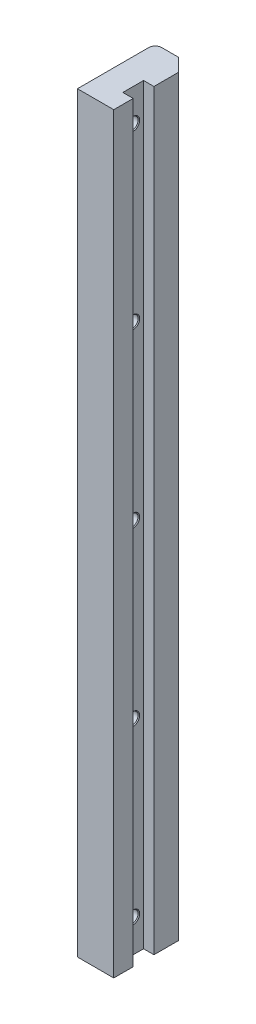
ISO-10303-21;
HEADER;
FILE_DESCRIPTION(('STEP AP214'),'2;1');
FILE_NAME('part.step','',(''),(''),'','','');
FILE_SCHEMA(('AUTOMOTIVE_DESIGN { 1 0 10303 214 1 1 1 1 }'));
ENDSEC;
DATA;
#1=APPLICATION_CONTEXT('core data for automotive mechanical design processes');
#2=APPLICATION_PROTOCOL_DEFINITION('international standard','automotive_design',2000,#1);
#3=PRODUCT_CONTEXT('',#1,'mechanical');
#4=PRODUCT('Part','Part','',(#3));
#5=PRODUCT_RELATED_PRODUCT_CATEGORY('part','',(#4));
#6=PRODUCT_DEFINITION_FORMATION('','',#4);
#7=PRODUCT_DEFINITION_CONTEXT('part definition',#1,'design');
#8=PRODUCT_DEFINITION('design','',#6,#7);
#9=PRODUCT_DEFINITION_SHAPE('','',#8);
#10=(LENGTH_UNIT() NAMED_UNIT(*) SI_UNIT(.MILLI.,.METRE.));
#11=(NAMED_UNIT(*) PLANE_ANGLE_UNIT() SI_UNIT($,.RADIAN.));
#12=(NAMED_UNIT(*) SI_UNIT($,.STERADIAN.) SOLID_ANGLE_UNIT());
#13=UNCERTAINTY_MEASURE_WITH_UNIT(LENGTH_MEASURE(1.E-05),#10,'distance_accuracy_value','');
#14=(GEOMETRIC_REPRESENTATION_CONTEXT(3) GLOBAL_UNCERTAINTY_ASSIGNED_CONTEXT((#13)) GLOBAL_UNIT_ASSIGNED_CONTEXT((#10,
#11,#12)) REPRESENTATION_CONTEXT('',''));
#15=CARTESIAN_POINT('',(0.,0.,0.));
#16=DIRECTION('',(0.,0.,1.));
#17=DIRECTION('',(1.,0.,0.));
#18=AXIS2_PLACEMENT_3D('',#15,#16,#17);
#19=CARTESIAN_POINT('',(6.,265.,6.99999999999999));
#20=DIRECTION('',(1.,0.,0.));
#21=DIRECTION('',(0.,0.,-1.));
#22=AXIS2_PLACEMENT_3D('',#19,#20,#21);
#23=CONICAL_SURFACE('',#22,5.025,0.785398163397438);
#24=CARTESIAN_POINT('',(5.375,265.,6.99999999999999));
#25=DIRECTION('',(1.,0.,0.));
#26=DIRECTION('',(0.,0.,-1.));
#27=AXIS2_PLACEMENT_3D('',#24,#25,#26);
#28=CIRCLE('',#27,4.40000000000001);
#29=CARTESIAN_POINT('',(5.375,265.,2.59999999999998));
#30=VERTEX_POINT('',#29);
#31=EDGE_CURVE('E11',#30,#30,#28,.T.);
#32=ORIENTED_EDGE('',*,*,#31,.F.);
#33=EDGE_LOOP('',(#32));
#34=FACE_BOUND('',#33,.T.);
#35=CARTESIAN_POINT('',(6.,265.,6.99999999999999));
#36=DIRECTION('',(1.,0.,0.));
#37=DIRECTION('',(0.,0.,-1.));
#38=AXIS2_PLACEMENT_3D('',#35,#36,#37);
#39=CIRCLE('',#38,5.025);
#40=CARTESIAN_POINT('',(6.,265.,1.97499999999999));
#41=VERTEX_POINT('',#40);
#42=EDGE_CURVE('E198',#41,#41,#39,.T.);
#43=ORIENTED_EDGE('',*,*,#42,.T.);
#44=EDGE_LOOP('',(#43));
#45=FACE_BOUND('',#44,.T.);
#46=ADVANCED_FACE('F45',(#34,#45),#23,.F.);
#47=CARTESIAN_POINT('',(6.,265.,6.99999999999999));
#48=DIRECTION('',(1.,0.,0.));
#49=DIRECTION('',(0.,0.,-1.));
#50=AXIS2_PLACEMENT_3D('',#47,#48,#49);
#51=CYLINDRICAL_SURFACE('',#50,4.40000000000001);
#52=CARTESIAN_POINT('',(-14.,265.,7.));
#53=DIRECTION('',(1.,0.,0.));
#54=DIRECTION('',(0.,0.,-1.));
#55=AXIS2_PLACEMENT_3D('',#52,#53,#54);
#56=CIRCLE('',#55,4.40000000000001);
#57=CARTESIAN_POINT('',(-14.,265.,2.59999999999998));
#58=VERTEX_POINT('',#57);
#59=EDGE_CURVE('E52',#58,#58,#56,.T.);
#60=ORIENTED_EDGE('',*,*,#59,.F.);
#61=EDGE_LOOP('',(#60));
#62=FACE_BOUND('',#61,.T.);
#63=ORIENTED_EDGE('',*,*,#31,.T.);
#64=EDGE_LOOP('',(#63));
#65=FACE_BOUND('',#64,.T.);
#66=ADVANCED_FACE('F205',(#62,#65),#51,.F.);
#67=CARTESIAN_POINT('',(6.,132.5,6.99999999999999));
#68=DIRECTION('',(1.,0.,0.));
#69=DIRECTION('',(0.,0.,-1.));
#70=AXIS2_PLACEMENT_3D('',#67,#68,#69);
#71=CONICAL_SURFACE('',#70,5.025,0.785398163397438);
#72=CARTESIAN_POINT('',(5.375,132.5,6.99999999999999));
#73=DIRECTION('',(1.,0.,0.));
#74=DIRECTION('',(0.,0.,-1.));
#75=AXIS2_PLACEMENT_3D('',#72,#73,#74);
#76=CIRCLE('',#75,4.40000000000001);
#77=CARTESIAN_POINT('',(5.375,132.5,2.59999999999998));
#78=VERTEX_POINT('',#77);
#79=EDGE_CURVE('E195',#78,#78,#76,.T.);
#80=ORIENTED_EDGE('',*,*,#79,.F.);
#81=EDGE_LOOP('',(#80));
#82=FACE_BOUND('',#81,.T.);
#83=CARTESIAN_POINT('',(6.,132.5,6.99999999999999));
#84=DIRECTION('',(1.,0.,0.));
#85=DIRECTION('',(0.,0.,-1.));
#86=AXIS2_PLACEMENT_3D('',#83,#84,#85);
#87=CIRCLE('',#86,5.025);
#88=CARTESIAN_POINT('',(6.,132.5,1.97499999999999));
#89=VERTEX_POINT('',#88);
#90=EDGE_CURVE('E189',#89,#89,#87,.T.);
#91=ORIENTED_EDGE('',*,*,#90,.T.);
#92=EDGE_LOOP('',(#91));
#93=FACE_BOUND('',#92,.T.);
#94=ADVANCED_FACE('F208',(#82,#93),#71,.F.);
#95=CARTESIAN_POINT('',(6.,132.5,6.99999999999999));
#96=DIRECTION('',(1.,0.,0.));
#97=DIRECTION('',(0.,0.,-1.));
#98=AXIS2_PLACEMENT_3D('',#95,#96,#97);
#99=CYLINDRICAL_SURFACE('',#98,4.40000000000001);
#100=CARTESIAN_POINT('',(-14.,132.5,7.));
#101=DIRECTION('',(1.,0.,0.));
#102=DIRECTION('',(0.,0.,-1.));
#103=AXIS2_PLACEMENT_3D('',#100,#101,#102);
#104=CIRCLE('',#103,4.40000000000001);
#105=CARTESIAN_POINT('',(-14.,132.5,2.59999999999998));
#106=VERTEX_POINT('',#105);
#107=EDGE_CURVE('E192',#106,#106,#104,.T.);
#108=ORIENTED_EDGE('',*,*,#107,.F.);
#109=EDGE_LOOP('',(#108));
#110=FACE_BOUND('',#109,.T.);
#111=ORIENTED_EDGE('',*,*,#79,.T.);
#112=EDGE_LOOP('',(#111));
#113=FACE_BOUND('',#112,.T.);
#114=ADVANCED_FACE('F270',(#110,#113),#99,.F.);
#115=CARTESIAN_POINT('',(6.,0.,6.99999999999999));
#116=DIRECTION('',(1.,0.,0.));
#117=DIRECTION('',(0.,0.,-1.));
#118=AXIS2_PLACEMENT_3D('',#115,#116,#117);
#119=CONICAL_SURFACE('',#118,5.025,0.785398163397438);
#120=CARTESIAN_POINT('',(5.375,0.,6.99999999999999));
#121=DIRECTION('',(1.,0.,0.));
#122=DIRECTION('',(0.,0.,-1.));
#123=AXIS2_PLACEMENT_3D('',#120,#121,#122);
#124=CIRCLE('',#123,4.40000000000001);
#125=CARTESIAN_POINT('',(5.375,0.,2.59999999999998));
#126=VERTEX_POINT('',#125);
#127=EDGE_CURVE('E186',#126,#126,#124,.T.);
#128=ORIENTED_EDGE('',*,*,#127,.F.);
#129=EDGE_LOOP('',(#128));
#130=FACE_BOUND('',#129,.T.);
#131=CARTESIAN_POINT('',(6.,0.,6.99999999999999));
#132=DIRECTION('',(1.,0.,0.));
#133=DIRECTION('',(0.,0.,-1.));
#134=AXIS2_PLACEMENT_3D('',#131,#132,#133);
#135=CIRCLE('',#134,5.025);
#136=CARTESIAN_POINT('',(6.,0.,1.97499999999999));
#137=VERTEX_POINT('',#136);
#138=EDGE_CURVE('E180',#137,#137,#135,.T.);
#139=ORIENTED_EDGE('',*,*,#138,.T.);
#140=EDGE_LOOP('',(#139));
#141=FACE_BOUND('',#140,.T.);
#142=ADVANCED_FACE('F266',(#130,#141),#119,.F.);
#143=CARTESIAN_POINT('',(6.,0.,6.99999999999999));
#144=DIRECTION('',(1.,0.,0.));
#145=DIRECTION('',(0.,0.,-1.));
#146=AXIS2_PLACEMENT_3D('',#143,#144,#145);
#147=CYLINDRICAL_SURFACE('',#146,4.40000000000001);
#148=CARTESIAN_POINT('',(-14.,0.,7.));
#149=DIRECTION('',(1.,0.,0.));
#150=DIRECTION('',(0.,0.,-1.));
#151=AXIS2_PLACEMENT_3D('',#148,#149,#150);
#152=CIRCLE('',#151,4.40000000000001);
#153=CARTESIAN_POINT('',(-14.,0.,2.59999999999998));
#154=VERTEX_POINT('',#153);
#155=EDGE_CURVE('E183',#154,#154,#152,.T.);
#156=ORIENTED_EDGE('',*,*,#155,.F.);
#157=EDGE_LOOP('',(#156));
#158=FACE_BOUND('',#157,.T.);
#159=ORIENTED_EDGE('',*,*,#127,.T.);
#160=EDGE_LOOP('',(#159));
#161=FACE_BOUND('',#160,.T.);
#162=ADVANCED_FACE('F263',(#158,#161),#147,.F.);
#163=CARTESIAN_POINT('',(14.,290.,-30.));
#164=DIRECTION('',(-1.,0.,0.));
#165=DIRECTION('',(0.,0.,1.));
#166=AXIS2_PLACEMENT_3D('',#163,#164,#165);
#167=PLANE('',#166);
#168=DIRECTION('',(0.,0.,-1.));
#169=VECTOR('',#168,1.);
#170=CARTESIAN_POINT('',(14.,-290.,-30.));
#171=LINE('',#170,#169);
#172=CARTESIAN_POINT('',(14.,-290.,30.));
#173=VERTEX_POINT('',#172);
#174=CARTESIAN_POINT('',(14.,-290.,15.));
#175=VERTEX_POINT('',#174);
#176=EDGE_CURVE('E147',#173,#175,#171,.T.);
#177=ORIENTED_EDGE('',*,*,#176,.T.);
#178=DIRECTION('',(0.,1.,0.));
#179=VECTOR('',#178,1.);
#180=CARTESIAN_POINT('',(14.,-290.,15.));
#181=LINE('',#180,#179);
#182=CARTESIAN_POINT('',(14.,290.,15.));
#183=VERTEX_POINT('',#182);
#184=EDGE_CURVE('E417',#175,#183,#181,.T.);
#185=ORIENTED_EDGE('',*,*,#184,.T.);
#186=DIRECTION('',(0.,0.,-1.));
#187=VECTOR('',#186,1.);
#188=CARTESIAN_POINT('',(14.,290.,-30.));
#189=LINE('',#188,#187);
#190=CARTESIAN_POINT('',(14.,290.,30.));
#191=VERTEX_POINT('',#190);
#192=EDGE_CURVE('E426',#191,#183,#189,.T.);
#193=ORIENTED_EDGE('',*,*,#192,.F.);
#194=DIRECTION('',(0.,-1.,0.));
#195=VECTOR('',#194,1.);
#196=CARTESIAN_POINT('',(14.,290.,30.));
#197=LINE('',#196,#195);
#198=EDGE_CURVE('E158',#191,#173,#197,.T.);
#199=ORIENTED_EDGE('',*,*,#198,.T.);
#200=EDGE_LOOP('',(#177,#185,#193,#199));
#201=FACE_BOUND('',#200,.T.);
#202=ADVANCED_FACE('F246',(#201),#167,.F.);
#203=CARTESIAN_POINT('',(-14.,290.,-30.));
#204=DIRECTION('',(1.,0.,0.));
#205=DIRECTION('',(0.,0.,-1.));
#206=AXIS2_PLACEMENT_3D('',#203,#204,#205);
#207=PLANE('',#206);
#208=CARTESIAN_POINT('',(-14.,-132.5,7.));
#209=DIRECTION('',(1.,0.,0.));
#210=DIRECTION('',(0.,0.,-1.));
#211=AXIS2_PLACEMENT_3D('',#208,#209,#210);
#212=CIRCLE('',#211,4.40000000000001);
#213=CARTESIAN_POINT('',(-14.,-132.5,2.59999999999998));
#214=VERTEX_POINT('',#213);
#215=EDGE_CURVE('E393',#214,#214,#212,.T.);
#216=ORIENTED_EDGE('',*,*,#215,.T.);
#217=EDGE_LOOP('',(#216));
#218=FACE_BOUND('',#217,.T.);
#219=CARTESIAN_POINT('',(-14.,-265.,7.));
#220=DIRECTION('',(1.,0.,0.));
#221=DIRECTION('',(0.,0.,-1.));
#222=AXIS2_PLACEMENT_3D('',#219,#220,#221);
#223=CIRCLE('',#222,4.40000000000001);
#224=CARTESIAN_POINT('',(-14.,-265.,2.59999999999998));
#225=VERTEX_POINT('',#224);
#226=EDGE_CURVE('E405',#225,#225,#223,.T.);
#227=ORIENTED_EDGE('',*,*,#226,.T.);
#228=EDGE_LOOP('',(#227));
#229=FACE_BOUND('',#228,.T.);
#230=DIRECTION('',(0.,0.,1.));
#231=VECTOR('',#230,1.);
#232=CARTESIAN_POINT('',(-14.,290.,-30.));
#233=LINE('',#232,#231);
#234=CARTESIAN_POINT('',(-14.,290.,-25.));
#235=VERTEX_POINT('',#234);
#236=CARTESIAN_POINT('',(-14.,290.,30.));
#237=VERTEX_POINT('',#236);
#238=EDGE_CURVE('E157',#235,#237,#233,.T.);
#239=ORIENTED_EDGE('',*,*,#238,.F.);
#240=DIRECTION('',(0.,-1.,0.));
#241=VECTOR('',#240,1.);
#242=CARTESIAN_POINT('',(-14.,290.,-25.));
#243=LINE('',#242,#241);
#244=CARTESIAN_POINT('',(-14.,-290.,-25.));
#245=VERTEX_POINT('',#244);
#246=EDGE_CURVE('E173',#235,#245,#243,.T.);
#247=ORIENTED_EDGE('',*,*,#246,.T.);
#248=DIRECTION('',(0.,0.,1.));
#249=VECTOR('',#248,1.);
#250=CARTESIAN_POINT('',(-14.,-290.,-30.));
#251=LINE('',#250,#249);
#252=CARTESIAN_POINT('',(-14.,-290.,30.));
#253=VERTEX_POINT('',#252);
#254=EDGE_CURVE('E152',#245,#253,#251,.T.);
#255=ORIENTED_EDGE('',*,*,#254,.T.);
#256=DIRECTION('',(0.,-1.,0.));
#257=VECTOR('',#256,1.);
#258=CARTESIAN_POINT('',(-14.,290.,30.));
#259=LINE('',#258,#257);
#260=EDGE_CURVE('E161',#237,#253,#259,.T.);
#261=ORIENTED_EDGE('',*,*,#260,.F.);
#262=EDGE_LOOP('',(#239,#247,#255,#261));
#263=FACE_BOUND('',#262,.T.);
#264=ORIENTED_EDGE('',*,*,#155,.T.);
#265=EDGE_LOOP('',(#264));
#266=FACE_BOUND('',#265,.T.);
#267=ORIENTED_EDGE('',*,*,#107,.T.);
#268=EDGE_LOOP('',(#267));
#269=FACE_BOUND('',#268,.T.);
#270=ORIENTED_EDGE('',*,*,#59,.T.);
#271=EDGE_LOOP('',(#270));
#272=FACE_BOUND('',#271,.T.);
#273=ADVANCED_FACE('F203',(#218,#229,#263,#266,#269,#272),#207,.F.);
#274=CARTESIAN_POINT('',(14.,290.,30.));
#275=DIRECTION('',(0.,0.,-1.));
#276=DIRECTION('',(-1.,0.,0.));
#277=AXIS2_PLACEMENT_3D('',#274,#275,#276);
#278=PLANE('',#277);
#279=DIRECTION('',(1.,0.,0.));
#280=VECTOR('',#279,1.);
#281=CARTESIAN_POINT('',(14.,-290.,30.));
#282=LINE('',#281,#280);
#283=EDGE_CURVE('E148',#253,#173,#282,.T.);
#284=ORIENTED_EDGE('',*,*,#283,.T.);
#285=ORIENTED_EDGE('',*,*,#198,.F.);
#286=DIRECTION('',(1.,0.,0.));
#287=VECTOR('',#286,1.);
#288=CARTESIAN_POINT('',(14.,290.,30.));
#289=LINE('',#288,#287);
#290=EDGE_CURVE('E424',#237,#191,#289,.T.);
#291=ORIENTED_EDGE('',*,*,#290,.F.);
#292=ORIENTED_EDGE('',*,*,#260,.T.);
#293=EDGE_LOOP('',(#284,#285,#291,#292));
#294=FACE_BOUND('',#293,.T.);
#295=ADVANCED_FACE('F245',(#294),#278,.F.);
#296=CARTESIAN_POINT('',(14.,-290.,-1.));
#297=VERTEX_POINT('',#296);
#298=CARTESIAN_POINT('',(14.,-290.,-19.9999999999999));
#299=VERTEX_POINT('',#298);
#300=EDGE_CURVE('E139',#297,#299,#171,.T.);
#301=ORIENTED_EDGE('',*,*,#300,.T.);
#302=DIRECTION('',(0.,1.,0.));
#303=VECTOR('',#302,1.);
#304=CARTESIAN_POINT('',(14.,290.,-19.9999999999999));
#305=LINE('',#304,#303);
#306=CARTESIAN_POINT('',(14.,290.,-19.9999999999999));
#307=VERTEX_POINT('',#306);
#308=EDGE_CURVE('E169',#299,#307,#305,.T.);
#309=ORIENTED_EDGE('',*,*,#308,.T.);
#310=CARTESIAN_POINT('',(14.,290.,-1.));
#311=VERTEX_POINT('',#310);
#312=EDGE_CURVE('E142',#311,#307,#189,.T.);
#313=ORIENTED_EDGE('',*,*,#312,.F.);
#314=DIRECTION('',(0.,1.,0.));
#315=VECTOR('',#314,1.);
#316=CARTESIAN_POINT('',(14.,-290.,-1.));
#317=LINE('',#316,#315);
#318=EDGE_CURVE('E127',#297,#311,#317,.T.);
#319=ORIENTED_EDGE('',*,*,#318,.F.);
#320=EDGE_LOOP('',(#301,#309,#313,#319));
#321=FACE_BOUND('',#320,.T.);
#322=ADVANCED_FACE('F138',(#321),#167,.F.);
#323=CARTESIAN_POINT('',(14.,290.,-30.));
#324=DIRECTION('',(0.,0.,1.));
#325=DIRECTION('',(1.,0.,0.));
#326=AXIS2_PLACEMENT_3D('',#323,#324,#325);
#327=PLANE('',#326);
#328=DIRECTION('',(-1.,0.,0.));
#329=VECTOR('',#328,1.);
#330=CARTESIAN_POINT('',(14.,-290.,-30.));
#331=LINE('',#330,#329);
#332=CARTESIAN_POINT('',(3.99999999999989,-290.,-30.));
#333=VERTEX_POINT('',#332);
#334=CARTESIAN_POINT('',(-8.99999999999999,-290.,-30.));
#335=VERTEX_POINT('',#334);
#336=EDGE_CURVE('E151',#333,#335,#331,.T.);
#337=ORIENTED_EDGE('',*,*,#336,.T.);
#338=DIRECTION('',(0.,-1.,0.));
#339=VECTOR('',#338,1.);
#340=CARTESIAN_POINT('',(-8.99999999999999,290.,-30.));
#341=LINE('',#340,#339);
#342=CARTESIAN_POINT('',(-8.99999999999999,290.,-30.));
#343=VERTEX_POINT('',#342);
#344=EDGE_CURVE('E59',#335,#343,#341,.F.);
#345=ORIENTED_EDGE('',*,*,#344,.T.);
#346=DIRECTION('',(-1.,0.,0.));
#347=VECTOR('',#346,1.);
#348=CARTESIAN_POINT('',(14.,290.,-30.));
#349=LINE('',#348,#347);
#350=CARTESIAN_POINT('',(3.99999999999989,290.,-30.));
#351=VERTEX_POINT('',#350);
#352=EDGE_CURVE('E162',#351,#343,#349,.T.);
#353=ORIENTED_EDGE('',*,*,#352,.F.);
#354=DIRECTION('',(0.,-1.,0.));
#355=VECTOR('',#354,1.);
#356=CARTESIAN_POINT('',(3.99999999999989,290.,-30.));
#357=LINE('',#356,#355);
#358=EDGE_CURVE('E165',#351,#333,#357,.T.);
#359=ORIENTED_EDGE('',*,*,#358,.T.);
#360=EDGE_LOOP('',(#337,#345,#353,#359));
#361=FACE_BOUND('',#360,.T.);
#362=ADVANCED_FACE('F237',(#361),#327,.F.);
#363=CARTESIAN_POINT('',(0.,290.,0.));
#364=DIRECTION('',(0.,-1.,0.));
#365=DIRECTION('',(0.,0.,-1.));
#366=AXIS2_PLACEMENT_3D('',#363,#364,#365);
#367=PLANE('',#366);
#368=ORIENTED_EDGE('',*,*,#352,.T.);
#369=CARTESIAN_POINT('',(-8.99999999999999,290.,-25.));
#370=DIRECTION('',(0.,-1.,0.));
#371=DIRECTION('',(0.,0.,-1.));
#372=AXIS2_PLACEMENT_3D('',#369,#370,#371);
#373=CIRCLE('',#372,5.);
#374=EDGE_CURVE('E178',#343,#235,#373,.F.);
#375=ORIENTED_EDGE('',*,*,#374,.T.);
#376=ORIENTED_EDGE('',*,*,#238,.T.);
#377=ORIENTED_EDGE('',*,*,#290,.T.);
#378=ORIENTED_EDGE('',*,*,#192,.T.);
#379=DIRECTION('',(1.,0.,0.));
#380=VECTOR('',#379,1.);
#381=CARTESIAN_POINT('',(14.,290.,15.));
#382=LINE('',#381,#380);
#383=CARTESIAN_POINT('',(6.00000000000001,290.,15.));
#384=VERTEX_POINT('',#383);
#385=EDGE_CURVE('E133',#384,#183,#382,.T.);
#386=ORIENTED_EDGE('',*,*,#385,.F.);
#387=DIRECTION('',(0.,0.,1.));
#388=VECTOR('',#387,1.);
#389=CARTESIAN_POINT('',(6.00000000000001,290.,15.));
#390=LINE('',#389,#388);
#391=CARTESIAN_POINT('',(6.,290.,-1.));
#392=VERTEX_POINT('',#391);
#393=EDGE_CURVE('E413',#392,#384,#390,.T.);
#394=ORIENTED_EDGE('',*,*,#393,.F.);
#395=DIRECTION('',(-1.,0.,0.));
#396=VECTOR('',#395,1.);
#397=CARTESIAN_POINT('',(14.,290.,-1.));
#398=LINE('',#397,#396);
#399=EDGE_CURVE('E407',#311,#392,#398,.T.);
#400=ORIENTED_EDGE('',*,*,#399,.F.);
#401=ORIENTED_EDGE('',*,*,#312,.T.);
#402=DIRECTION('',(0.707106781186548,0.,0.707106781186548));
#403=VECTOR('',#402,1.);
#404=CARTESIAN_POINT('',(3.99999999999989,290.,-30.));
#405=LINE('',#404,#403);
#406=EDGE_CURVE('E171',#307,#351,#405,.F.);
#407=ORIENTED_EDGE('',*,*,#406,.T.);
#408=EDGE_LOOP('',(#368,#375,#376,#377,#378,#386,#394,#400,#401,#407));
#409=FACE_BOUND('',#408,.T.);
#410=ADVANCED_FACE('F234',(#409),#367,.F.);
#411=CARTESIAN_POINT('',(0.,-290.,0.));
#412=DIRECTION('',(0.,-1.,0.));
#413=DIRECTION('',(0.,0.,-1.));
#414=AXIS2_PLACEMENT_3D('',#411,#412,#413);
#415=PLANE('',#414);
#416=ORIENTED_EDGE('',*,*,#254,.F.);
#417=CARTESIAN_POINT('',(-8.99999999999999,-290.,-25.));
#418=DIRECTION('',(0.,-1.,0.));
#419=DIRECTION('',(0.,0.,-1.));
#420=AXIS2_PLACEMENT_3D('',#417,#418,#419);
#421=CIRCLE('',#420,5.);
#422=EDGE_CURVE('E67',#245,#335,#421,.T.);
#423=ORIENTED_EDGE('',*,*,#422,.T.);
#424=ORIENTED_EDGE('',*,*,#336,.F.);
#425=DIRECTION('',(-0.707106781186548,0.,-0.707106781186548));
#426=VECTOR('',#425,1.);
#427=CARTESIAN_POINT('',(16.9999999999999,-290.,-16.9999999999999));
#428=LINE('',#427,#426);
#429=EDGE_CURVE('E146',#333,#299,#428,.F.);
#430=ORIENTED_EDGE('',*,*,#429,.T.);
#431=ORIENTED_EDGE('',*,*,#300,.F.);
#432=DIRECTION('',(-1.,0.,0.));
#433=VECTOR('',#432,1.);
#434=CARTESIAN_POINT('',(14.,-290.,-1.));
#435=LINE('',#434,#433);
#436=CARTESIAN_POINT('',(6.,-290.,-1.));
#437=VERTEX_POINT('',#436);
#438=EDGE_CURVE('E123',#297,#437,#435,.T.);
#439=ORIENTED_EDGE('',*,*,#438,.T.);
#440=DIRECTION('',(0.,0.,1.));
#441=VECTOR('',#440,1.);
#442=CARTESIAN_POINT('',(6.00000000000001,-290.,15.));
#443=LINE('',#442,#441);
#444=CARTESIAN_POINT('',(6.00000000000001,-290.,15.));
#445=VERTEX_POINT('',#444);
#446=EDGE_CURVE('E132',#437,#445,#443,.T.);
#447=ORIENTED_EDGE('',*,*,#446,.T.);
#448=DIRECTION('',(1.,0.,0.));
#449=VECTOR('',#448,1.);
#450=CARTESIAN_POINT('',(14.,-290.,15.));
#451=LINE('',#450,#449);
#452=EDGE_CURVE('E143',#445,#175,#451,.T.);
#453=ORIENTED_EDGE('',*,*,#452,.T.);
#454=ORIENTED_EDGE('',*,*,#176,.F.);
#455=ORIENTED_EDGE('',*,*,#283,.F.);
#456=EDGE_LOOP('',(#416,#423,#424,#430,#431,#439,#447,#453,#454,#455));
#457=FACE_BOUND('',#456,.T.);
#458=ADVANCED_FACE('F145',(#457),#415,.T.);
#459=CARTESIAN_POINT('',(14.,-290.,15.));
#460=DIRECTION('',(0.,0.,1.));
#461=DIRECTION('',(1.,0.,0.));
#462=AXIS2_PLACEMENT_3D('',#459,#460,#461);
#463=PLANE('',#462);
#464=ORIENTED_EDGE('',*,*,#385,.T.);
#465=ORIENTED_EDGE('',*,*,#184,.F.);
#466=ORIENTED_EDGE('',*,*,#452,.F.);
#467=DIRECTION('',(0.,1.,0.));
#468=VECTOR('',#467,1.);
#469=CARTESIAN_POINT('',(6.00000000000001,-290.,15.));
#470=LINE('',#469,#468);
#471=EDGE_CURVE('E420',#445,#384,#470,.T.);
#472=ORIENTED_EDGE('',*,*,#471,.T.);
#473=EDGE_LOOP('',(#464,#465,#466,#472));
#474=FACE_BOUND('',#473,.T.);
#475=ADVANCED_FACE('F217',(#474),#463,.F.);
#476=CARTESIAN_POINT('',(6.00000000000001,-290.,15.));
#477=DIRECTION('',(-1.,0.,0.));
#478=DIRECTION('',(0.,0.,1.));
#479=AXIS2_PLACEMENT_3D('',#476,#477,#478);
#480=PLANE('',#479);
#481=CARTESIAN_POINT('',(6.,-132.5,6.99999999999999));
#482=DIRECTION('',(1.,0.,0.));
#483=DIRECTION('',(0.,0.,-1.));
#484=AXIS2_PLACEMENT_3D('',#481,#482,#483);
#485=CIRCLE('',#484,5.025);
#486=CARTESIAN_POINT('',(6.,-132.5,1.97499999999999));
#487=VERTEX_POINT('',#486);
#488=EDGE_CURVE('E392',#487,#487,#485,.T.);
#489=ORIENTED_EDGE('',*,*,#488,.F.);
#490=EDGE_LOOP('',(#489));
#491=FACE_BOUND('',#490,.T.);
#492=CARTESIAN_POINT('',(6.,-265.,6.99999999999999));
#493=DIRECTION('',(1.,0.,0.));
#494=DIRECTION('',(0.,0.,-1.));
#495=AXIS2_PLACEMENT_3D('',#492,#493,#494);
#496=CIRCLE('',#495,5.025);
#497=CARTESIAN_POINT('',(6.,-265.,1.97499999999999));
#498=VERTEX_POINT('',#497);
#499=EDGE_CURVE('E399',#498,#498,#496,.T.);
#500=ORIENTED_EDGE('',*,*,#499,.F.);
#501=EDGE_LOOP('',(#500));
#502=FACE_BOUND('',#501,.T.);
#503=ORIENTED_EDGE('',*,*,#393,.T.);
#504=ORIENTED_EDGE('',*,*,#471,.F.);
#505=ORIENTED_EDGE('',*,*,#446,.F.);
#506=DIRECTION('',(0.,1.,0.));
#507=VECTOR('',#506,1.);
#508=CARTESIAN_POINT('',(6.,-290.,-1.));
#509=LINE('',#508,#507);
#510=EDGE_CURVE('E129',#437,#392,#509,.T.);
#511=ORIENTED_EDGE('',*,*,#510,.T.);
#512=EDGE_LOOP('',(#503,#504,#505,#511));
#513=FACE_BOUND('',#512,.T.);
#514=ORIENTED_EDGE('',*,*,#138,.F.);
#515=EDGE_LOOP('',(#514));
#516=FACE_BOUND('',#515,.T.);
#517=ORIENTED_EDGE('',*,*,#90,.F.);
#518=EDGE_LOOP('',(#517));
#519=FACE_BOUND('',#518,.T.);
#520=ORIENTED_EDGE('',*,*,#42,.F.);
#521=EDGE_LOOP('',(#520));
#522=FACE_BOUND('',#521,.T.);
#523=ADVANCED_FACE('F215',(#491,#502,#513,#516,#519,#522),#480,.F.);
#524=CARTESIAN_POINT('',(14.,-290.,-1.));
#525=DIRECTION('',(0.,0.,-1.));
#526=DIRECTION('',(-1.,0.,0.));
#527=AXIS2_PLACEMENT_3D('',#524,#525,#526);
#528=PLANE('',#527);
#529=ORIENTED_EDGE('',*,*,#399,.T.);
#530=ORIENTED_EDGE('',*,*,#510,.F.);
#531=ORIENTED_EDGE('',*,*,#438,.F.);
#532=ORIENTED_EDGE('',*,*,#318,.T.);
#533=EDGE_LOOP('',(#529,#530,#531,#532));
#534=FACE_BOUND('',#533,.T.);
#535=ADVANCED_FACE('F126',(#534),#528,.F.);
#536=CARTESIAN_POINT('',(3.99999999999989,290.,-30.));
#537=DIRECTION('',(-0.707106781186547,0.,0.707106781186547));
#538=DIRECTION('',(0.,-1.,0.));
#539=AXIS2_PLACEMENT_3D('',#536,#537,#538);
#540=PLANE('',#539);
#541=ORIENTED_EDGE('',*,*,#406,.F.);
#542=ORIENTED_EDGE('',*,*,#308,.F.);
#543=ORIENTED_EDGE('',*,*,#429,.F.);
#544=ORIENTED_EDGE('',*,*,#358,.F.);
#545=EDGE_LOOP('',(#541,#542,#543,#544));
#546=FACE_BOUND('',#545,.T.);
#547=ADVANCED_FACE('F225',(#546),#540,.F.);
#548=CARTESIAN_POINT('',(-8.99999999999999,290.,-25.));
#549=DIRECTION('',(0.,-1.,0.));
#550=DIRECTION('',(0.,0.,-1.));
#551=AXIS2_PLACEMENT_3D('',#548,#549,#550);
#552=CYLINDRICAL_SURFACE('',#551,5.);
#553=ORIENTED_EDGE('',*,*,#374,.F.);
#554=ORIENTED_EDGE('',*,*,#344,.F.);
#555=ORIENTED_EDGE('',*,*,#422,.F.);
#556=ORIENTED_EDGE('',*,*,#246,.F.);
#557=EDGE_LOOP('',(#553,#554,#555,#556));
#558=FACE_BOUND('',#557,.T.);
#559=ADVANCED_FACE('F257',(#558),#552,.T.);
#560=CARTESIAN_POINT('',(6.,-265.,6.99999999999999));
#561=DIRECTION('',(1.,0.,0.));
#562=DIRECTION('',(0.,0.,-1.));
#563=AXIS2_PLACEMENT_3D('',#560,#561,#562);
#564=CYLINDRICAL_SURFACE('',#563,4.40000000000001);
#565=ORIENTED_EDGE('',*,*,#226,.F.);
#566=EDGE_LOOP('',(#565));
#567=FACE_BOUND('',#566,.T.);
#568=CARTESIAN_POINT('',(5.375,-265.,6.99999999999999));
#569=DIRECTION('',(1.,0.,0.));
#570=DIRECTION('',(0.,0.,-1.));
#571=AXIS2_PLACEMENT_3D('',#568,#569,#570);
#572=CIRCLE('',#571,4.40000000000001);
#573=CARTESIAN_POINT('',(5.375,-265.,2.59999999999998));
#574=VERTEX_POINT('',#573);
#575=EDGE_CURVE('E402',#574,#574,#572,.T.);
#576=ORIENTED_EDGE('',*,*,#575,.T.);
#577=EDGE_LOOP('',(#576));
#578=FACE_BOUND('',#577,.T.);
#579=ADVANCED_FACE('F261',(#567,#578),#564,.F.);
#580=CARTESIAN_POINT('',(6.,-265.,6.99999999999999));
#581=DIRECTION('',(1.,0.,0.));
#582=DIRECTION('',(0.,0.,-1.));
#583=AXIS2_PLACEMENT_3D('',#580,#581,#582);
#584=CONICAL_SURFACE('',#583,5.025,0.785398163397438);
#585=ORIENTED_EDGE('',*,*,#575,.F.);
#586=EDGE_LOOP('',(#585));
#587=FACE_BOUND('',#586,.T.);
#588=ORIENTED_EDGE('',*,*,#499,.T.);
#589=EDGE_LOOP('',(#588));
#590=FACE_BOUND('',#589,.T.);
#591=ADVANCED_FACE('F313',(#587,#590),#584,.F.);
#592=CARTESIAN_POINT('',(6.,-132.5,6.99999999999999));
#593=DIRECTION('',(1.,0.,0.));
#594=DIRECTION('',(0.,0.,-1.));
#595=AXIS2_PLACEMENT_3D('',#592,#593,#594);
#596=CYLINDRICAL_SURFACE('',#595,4.40000000000001);
#597=ORIENTED_EDGE('',*,*,#215,.F.);
#598=EDGE_LOOP('',(#597));
#599=FACE_BOUND('',#598,.T.);
#600=CARTESIAN_POINT('',(5.375,-132.5,6.99999999999999));
#601=DIRECTION('',(1.,0.,0.));
#602=DIRECTION('',(0.,0.,-1.));
#603=AXIS2_PLACEMENT_3D('',#600,#601,#602);
#604=CIRCLE('',#603,4.40000000000001);
#605=CARTESIAN_POINT('',(5.375,-132.5,2.59999999999998));
#606=VERTEX_POINT('',#605);
#607=EDGE_CURVE('E390',#606,#606,#604,.T.);
#608=ORIENTED_EDGE('',*,*,#607,.T.);
#609=EDGE_LOOP('',(#608));
#610=FACE_BOUND('',#609,.T.);
#611=ADVANCED_FACE('F309',(#599,#610),#596,.F.);
#612=CARTESIAN_POINT('',(6.,-132.5,6.99999999999999));
#613=DIRECTION('',(1.,0.,0.));
#614=DIRECTION('',(0.,0.,-1.));
#615=AXIS2_PLACEMENT_3D('',#612,#613,#614);
#616=CONICAL_SURFACE('',#615,5.025,0.785398163397438);
#617=ORIENTED_EDGE('',*,*,#607,.F.);
#618=EDGE_LOOP('',(#617));
#619=FACE_BOUND('',#618,.T.);
#620=ORIENTED_EDGE('',*,*,#488,.T.);
#621=EDGE_LOOP('',(#620));
#622=FACE_BOUND('',#621,.T.);
#623=ADVANCED_FACE('F312',(#619,#622),#616,.F.);
#624=CLOSED_SHELL('',(#46,#66,#94,#114,#142,#162,#202,#273,#295,#322,#362,#410,#458,#475,#523,
#535,#547,#559,#579,#591,#611,#623));
#625=MANIFOLD_SOLID_BREP('B2',#624);
#626=ADVANCED_BREP_SHAPE_REPRESENTATION('',(#18,#625),#14);
#627=SHAPE_DEFINITION_REPRESENTATION(#9,#626);
ENDSEC;
END-ISO-10303-21;
